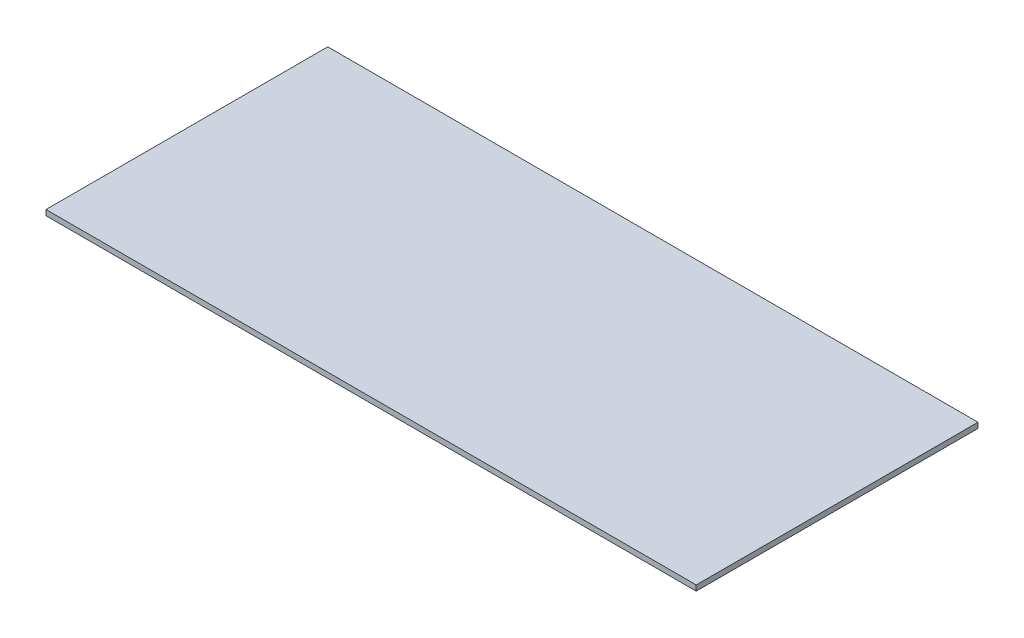
ISO-10303-21;
HEADER;
FILE_DESCRIPTION(('STEP AP214'),'2;1');
FILE_NAME('part.step','',(''),(''),'','','');
FILE_SCHEMA(('AUTOMOTIVE_DESIGN { 1 0 10303 214 1 1 1 1 }'));
ENDSEC;
DATA;
#1=APPLICATION_CONTEXT('core data for automotive mechanical design processes');
#2=APPLICATION_PROTOCOL_DEFINITION('international standard','automotive_design',2000,#1);
#3=PRODUCT_CONTEXT('',#1,'mechanical');
#4=PRODUCT('Part','Part','',(#3));
#5=PRODUCT_RELATED_PRODUCT_CATEGORY('part','',(#4));
#6=PRODUCT_DEFINITION_FORMATION('','',#4);
#7=PRODUCT_DEFINITION_CONTEXT('part definition',#1,'design');
#8=PRODUCT_DEFINITION('design','',#6,#7);
#9=PRODUCT_DEFINITION_SHAPE('','',#8);
#10=(LENGTH_UNIT() NAMED_UNIT(*) SI_UNIT(.MILLI.,.METRE.));
#11=(NAMED_UNIT(*) PLANE_ANGLE_UNIT() SI_UNIT($,.RADIAN.));
#12=(NAMED_UNIT(*) SI_UNIT($,.STERADIAN.) SOLID_ANGLE_UNIT());
#13=UNCERTAINTY_MEASURE_WITH_UNIT(LENGTH_MEASURE(1.E-05),#10,'distance_accuracy_value','');
#14=(GEOMETRIC_REPRESENTATION_CONTEXT(3) GLOBAL_UNCERTAINTY_ASSIGNED_CONTEXT((#13)) GLOBAL_UNIT_ASSIGNED_CONTEXT((#10,
#11,#12)) REPRESENTATION_CONTEXT('',''));
#15=CARTESIAN_POINT('',(0.,0.,0.));
#16=DIRECTION('',(0.,0.,1.));
#17=DIRECTION('',(1.,0.,0.));
#18=AXIS2_PLACEMENT_3D('',#15,#16,#17);
#19=CARTESIAN_POINT('',(190.5,3.175,82.55));
#20=DIRECTION('',(-1.,0.,0.));
#21=DIRECTION('',(0.,0.,1.));
#22=AXIS2_PLACEMENT_3D('',#19,#20,#21);
#23=PLANE('',#22);
#24=DIRECTION('',(0.,0.,-1.));
#25=VECTOR('',#24,1.);
#26=CARTESIAN_POINT('',(190.5,0.,82.55));
#27=LINE('',#26,#25);
#28=CARTESIAN_POINT('',(190.5,0.,82.55));
#29=VERTEX_POINT('',#28);
#30=CARTESIAN_POINT('',(190.5,0.,-82.55));
#31=VERTEX_POINT('',#30);
#32=EDGE_CURVE('E102',#29,#31,#27,.T.);
#33=ORIENTED_EDGE('',*,*,#32,.T.);
#34=DIRECTION('',(0.,-1.,0.));
#35=VECTOR('',#34,1.);
#36=CARTESIAN_POINT('',(190.5,3.175,-82.55));
#37=LINE('',#36,#35);
#38=CARTESIAN_POINT('',(190.5,3.175,-82.55));
#39=VERTEX_POINT('',#38);
#40=EDGE_CURVE('E11',#39,#31,#37,.T.);
#41=ORIENTED_EDGE('',*,*,#40,.F.);
#42=DIRECTION('',(0.,0.,-1.));
#43=VECTOR('',#42,1.);
#44=CARTESIAN_POINT('',(190.5,3.175,82.55));
#45=LINE('',#44,#43);
#46=CARTESIAN_POINT('',(190.5,3.175,82.55));
#47=VERTEX_POINT('',#46);
#48=EDGE_CURVE('E90',#47,#39,#45,.T.);
#49=ORIENTED_EDGE('',*,*,#48,.F.);
#50=DIRECTION('',(0.,-1.,0.));
#51=VECTOR('',#50,1.);
#52=CARTESIAN_POINT('',(190.5,3.175,82.55));
#53=LINE('',#52,#51);
#54=EDGE_CURVE('E98',#47,#29,#53,.T.);
#55=ORIENTED_EDGE('',*,*,#54,.T.);
#56=EDGE_LOOP('',(#33,#41,#49,#55));
#57=FACE_BOUND('',#56,.T.);
#58=ADVANCED_FACE('F39',(#57),#23,.F.);
#59=CARTESIAN_POINT('',(-190.5,3.175,-82.55));
#60=DIRECTION('',(0.,0.,1.));
#61=DIRECTION('',(1.,0.,0.));
#62=AXIS2_PLACEMENT_3D('',#59,#60,#61);
#63=PLANE('',#62);
#64=DIRECTION('',(-1.,0.,0.));
#65=VECTOR('',#64,1.);
#66=CARTESIAN_POINT('',(-190.5,0.,-82.55));
#67=LINE('',#66,#65);
#68=CARTESIAN_POINT('',(-190.5,0.,-82.55));
#69=VERTEX_POINT('',#68);
#70=EDGE_CURVE('E94',#31,#69,#67,.T.);
#71=ORIENTED_EDGE('',*,*,#70,.T.);
#72=DIRECTION('',(0.,-1.,0.));
#73=VECTOR('',#72,1.);
#74=CARTESIAN_POINT('',(-190.5,3.175,-82.55));
#75=LINE('',#74,#73);
#76=CARTESIAN_POINT('',(-190.5,3.175,-82.55));
#77=VERTEX_POINT('',#76);
#78=EDGE_CURVE('E47',#77,#69,#75,.T.);
#79=ORIENTED_EDGE('',*,*,#78,.F.);
#80=DIRECTION('',(-1.,0.,0.));
#81=VECTOR('',#80,1.);
#82=CARTESIAN_POINT('',(-190.5,3.175,-82.55));
#83=LINE('',#82,#81);
#84=EDGE_CURVE('E85',#39,#77,#83,.T.);
#85=ORIENTED_EDGE('',*,*,#84,.F.);
#86=ORIENTED_EDGE('',*,*,#40,.T.);
#87=EDGE_LOOP('',(#71,#79,#85,#86));
#88=FACE_BOUND('',#87,.T.);
#89=ADVANCED_FACE('F93',(#88),#63,.F.);
#90=CARTESIAN_POINT('',(-190.5,3.175,82.55));
#91=DIRECTION('',(1.,0.,0.));
#92=DIRECTION('',(0.,0.,-1.));
#93=AXIS2_PLACEMENT_3D('',#90,#91,#92);
#94=PLANE('',#93);
#95=DIRECTION('',(0.,0.,1.));
#96=VECTOR('',#95,1.);
#97=CARTESIAN_POINT('',(-190.5,0.,82.55));
#98=LINE('',#97,#96);
#99=CARTESIAN_POINT('',(-190.5,0.,82.55));
#100=VERTEX_POINT('',#99);
#101=EDGE_CURVE('E72',#69,#100,#98,.T.);
#102=ORIENTED_EDGE('',*,*,#101,.T.);
#103=DIRECTION('',(0.,-1.,0.));
#104=VECTOR('',#103,1.);
#105=CARTESIAN_POINT('',(-190.5,3.175,82.55));
#106=LINE('',#105,#104);
#107=CARTESIAN_POINT('',(-190.5,3.175,82.55));
#108=VERTEX_POINT('',#107);
#109=EDGE_CURVE('E95',#108,#100,#106,.T.);
#110=ORIENTED_EDGE('',*,*,#109,.F.);
#111=DIRECTION('',(0.,0.,1.));
#112=VECTOR('',#111,1.);
#113=CARTESIAN_POINT('',(-190.5,3.175,82.55));
#114=LINE('',#113,#112);
#115=EDGE_CURVE('E88',#77,#108,#114,.T.);
#116=ORIENTED_EDGE('',*,*,#115,.F.);
#117=ORIENTED_EDGE('',*,*,#78,.T.);
#118=EDGE_LOOP('',(#102,#110,#116,#117));
#119=FACE_BOUND('',#118,.T.);
#120=ADVANCED_FACE('F96',(#119),#94,.F.);
#121=CARTESIAN_POINT('',(-190.5,3.175,82.55));
#122=DIRECTION('',(0.,0.,-1.));
#123=DIRECTION('',(-1.,0.,0.));
#124=AXIS2_PLACEMENT_3D('',#121,#122,#123);
#125=PLANE('',#124);
#126=DIRECTION('',(1.,0.,0.));
#127=VECTOR('',#126,1.);
#128=CARTESIAN_POINT('',(-190.5,0.,82.55));
#129=LINE('',#128,#127);
#130=EDGE_CURVE('E78',#100,#29,#129,.T.);
#131=ORIENTED_EDGE('',*,*,#130,.T.);
#132=ORIENTED_EDGE('',*,*,#54,.F.);
#133=DIRECTION('',(1.,0.,0.));
#134=VECTOR('',#133,1.);
#135=CARTESIAN_POINT('',(-190.5,3.175,82.55));
#136=LINE('',#135,#134);
#137=EDGE_CURVE('E55',#108,#47,#136,.T.);
#138=ORIENTED_EDGE('',*,*,#137,.F.);
#139=ORIENTED_EDGE('',*,*,#109,.T.);
#140=EDGE_LOOP('',(#131,#132,#138,#139));
#141=FACE_BOUND('',#140,.T.);
#142=ADVANCED_FACE('F109',(#141),#125,.F.);
#143=CARTESIAN_POINT('',(0.,3.175,0.));
#144=DIRECTION('',(0.,-1.,0.));
#145=DIRECTION('',(0.,0.,-1.));
#146=AXIS2_PLACEMENT_3D('',#143,#144,#145);
#147=PLANE('',#146);
#148=ORIENTED_EDGE('',*,*,#48,.T.);
#149=ORIENTED_EDGE('',*,*,#84,.T.);
#150=ORIENTED_EDGE('',*,*,#115,.T.);
#151=ORIENTED_EDGE('',*,*,#137,.T.);
#152=EDGE_LOOP('',(#148,#149,#150,#151));
#153=FACE_BOUND('',#152,.T.);
#154=ADVANCED_FACE('F86',(#153),#147,.F.);
#155=CARTESIAN_POINT('',(0.,0.,0.));
#156=DIRECTION('',(0.,-1.,0.));
#157=DIRECTION('',(0.,0.,-1.));
#158=AXIS2_PLACEMENT_3D('',#155,#156,#157);
#159=PLANE('',#158);
#160=ORIENTED_EDGE('',*,*,#32,.F.);
#161=ORIENTED_EDGE('',*,*,#130,.F.);
#162=ORIENTED_EDGE('',*,*,#101,.F.);
#163=ORIENTED_EDGE('',*,*,#70,.F.);
#164=EDGE_LOOP('',(#160,#161,#162,#163));
#165=FACE_BOUND('',#164,.T.);
#166=ADVANCED_FACE('F112',(#165),#159,.T.);
#167=CLOSED_SHELL('',(#58,#89,#120,#142,#154,#166));
#168=MANIFOLD_SOLID_BREP('B2',#167);
#169=ADVANCED_BREP_SHAPE_REPRESENTATION('',(#18,#168),#14);
#170=SHAPE_DEFINITION_REPRESENTATION(#9,#169);
ENDSEC;
END-ISO-10303-21;
